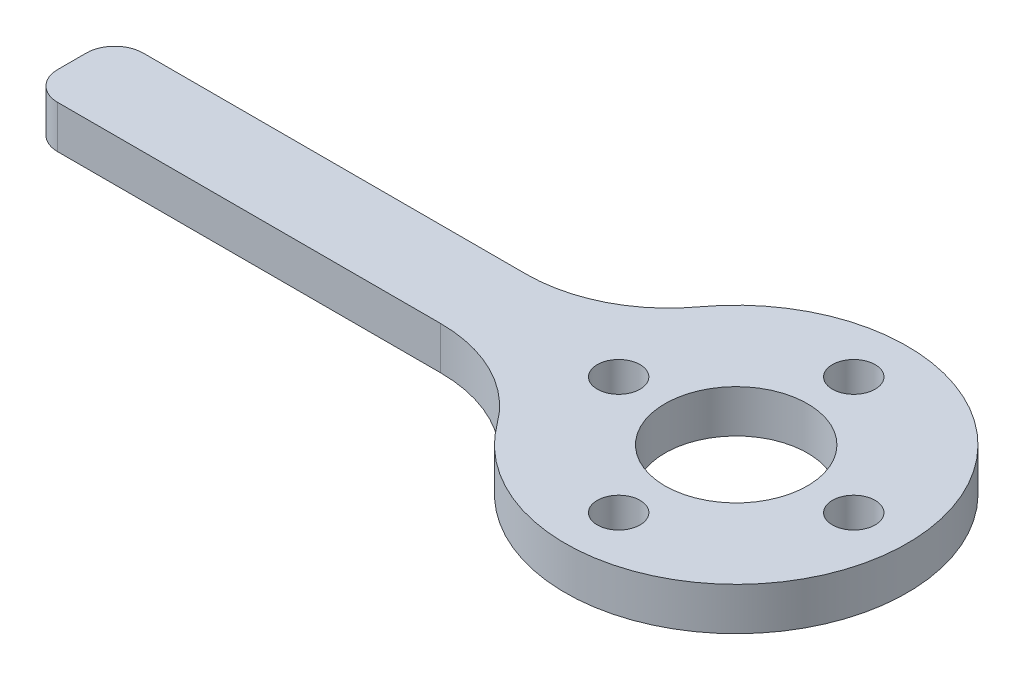
ISO-10303-21;
HEADER;
FILE_DESCRIPTION(('STEP AP214'),'2;1');
FILE_NAME('part.step','',(''),(''),'','','');
FILE_SCHEMA(('AUTOMOTIVE_DESIGN { 1 0 10303 214 1 1 1 1 }'));
ENDSEC;
DATA;
#1=APPLICATION_CONTEXT('core data for automotive mechanical design processes');
#2=APPLICATION_PROTOCOL_DEFINITION('international standard','automotive_design',2000,#1);
#3=PRODUCT_CONTEXT('',#1,'mechanical');
#4=PRODUCT('Part','Part','',(#3));
#5=PRODUCT_RELATED_PRODUCT_CATEGORY('part','',(#4));
#6=PRODUCT_DEFINITION_FORMATION('','',#4);
#7=PRODUCT_DEFINITION_CONTEXT('part definition',#1,'design');
#8=PRODUCT_DEFINITION('design','',#6,#7);
#9=PRODUCT_DEFINITION_SHAPE('','',#8);
#10=(LENGTH_UNIT() NAMED_UNIT(*) SI_UNIT(.MILLI.,.METRE.));
#11=(NAMED_UNIT(*) PLANE_ANGLE_UNIT() SI_UNIT($,.RADIAN.));
#12=(NAMED_UNIT(*) SI_UNIT($,.STERADIAN.) SOLID_ANGLE_UNIT());
#13=UNCERTAINTY_MEASURE_WITH_UNIT(LENGTH_MEASURE(1.E-05),#10,'distance_accuracy_value','');
#14=(GEOMETRIC_REPRESENTATION_CONTEXT(3) GLOBAL_UNCERTAINTY_ASSIGNED_CONTEXT((#13)) GLOBAL_UNIT_ASSIGNED_CONTEXT((#10,
#11,#12)) REPRESENTATION_CONTEXT('',''));
#15=CARTESIAN_POINT('',(0.,0.,0.));
#16=DIRECTION('',(0.,0.,1.));
#17=DIRECTION('',(1.,0.,0.));
#18=AXIS2_PLACEMENT_3D('',#15,#16,#17);
#19=CARTESIAN_POINT('',(0.,3.,0.));
#20=DIRECTION('',(0.,1.,0.));
#21=DIRECTION('',(0.,0.,1.));
#22=AXIS2_PLACEMENT_3D('',#19,#20,#21);
#23=PLANE('',#22);
#24=CARTESIAN_POINT('',(0.,3.,-8.25));
#25=DIRECTION('',(0.,1.,0.));
#26=DIRECTION('',(0.,0.,1.));
#27=AXIS2_PLACEMENT_3D('',#24,#25,#26);
#28=CIRCLE('',#27,1.5);
#29=CARTESIAN_POINT('',(0.,3.,-6.75));
#30=VERTEX_POINT('',#29);
#31=EDGE_CURVE('E322',#30,#30,#28,.T.);
#32=ORIENTED_EDGE('',*,*,#31,.F.);
#33=EDGE_LOOP('',(#32));
#34=FACE_BOUND('',#33,.T.);
#35=CARTESIAN_POINT('',(8.2500000000002,3.,-1.9867642048302E-13));
#36=DIRECTION('',(0.,1.,0.));
#37=DIRECTION('',(0.,0.,1.));
#38=AXIS2_PLACEMENT_3D('',#35,#36,#37);
#39=CIRCLE('',#38,1.5);
#40=CARTESIAN_POINT('',(8.2500000000002,3.,1.4999999999998));
#41=VERTEX_POINT('',#40);
#42=EDGE_CURVE('E328',#41,#41,#39,.T.);
#43=ORIENTED_EDGE('',*,*,#42,.F.);
#44=EDGE_LOOP('',(#43));
#45=FACE_BOUND('',#44,.T.);
#46=CARTESIAN_POINT('',(3.96847674161392E-13,3.,8.25));
#47=DIRECTION('',(0.,1.,0.));
#48=DIRECTION('',(0.,0.,1.));
#49=AXIS2_PLACEMENT_3D('',#46,#47,#48);
#50=CIRCLE('',#49,1.5);
#51=CARTESIAN_POINT('',(3.96847674161392E-13,3.,9.75));
#52=VERTEX_POINT('',#51);
#53=EDGE_CURVE('E336',#52,#52,#50,.T.);
#54=ORIENTED_EDGE('',*,*,#53,.F.);
#55=EDGE_LOOP('',(#54));
#56=FACE_BOUND('',#55,.T.);
#57=CARTESIAN_POINT('',(-8.2499999999998,3.,1.99686754092316E-13));
#58=DIRECTION('',(0.,1.,0.));
#59=DIRECTION('',(0.,0.,1.));
#60=AXIS2_PLACEMENT_3D('',#57,#58,#59);
#61=CIRCLE('',#60,1.5);
#62=CARTESIAN_POINT('',(-8.2499999999998,3.,1.5000000000002));
#63=VERTEX_POINT('',#62);
#64=EDGE_CURVE('E342',#63,#63,#61,.T.);
#65=ORIENTED_EDGE('',*,*,#64,.F.);
#66=EDGE_LOOP('',(#65));
#67=FACE_BOUND('',#66,.T.);
#68=CARTESIAN_POINT('',(0.,3.,0.));
#69=DIRECTION('',(0.,1.,0.));
#70=DIRECTION('',(0.,0.,1.));
#71=AXIS2_PLACEMENT_3D('',#68,#69,#70);
#72=CIRCLE('',#71,12.);
#73=CARTESIAN_POINT('',(-9.68085782689028,3.,7.09090909090909));
#74=VERTEX_POINT('',#73);
#75=CARTESIAN_POINT('',(-9.68085782689028,3.,-7.09090909090909));
#76=VERTEX_POINT('',#75);
#77=EDGE_CURVE('E128',#74,#76,#72,.T.);
#78=ORIENTED_EDGE('',*,*,#77,.T.);
#79=CARTESIAN_POINT('',(-17.7482393492988,3.,-13.));
#80=DIRECTION('',(0.,1.,0.));
#81=DIRECTION('',(0.,0.,1.));
#82=AXIS2_PLACEMENT_3D('',#79,#80,#81);
#83=CIRCLE('',#82,10.);
#84=CARTESIAN_POINT('',(-17.7482393492988,3.,-3.));
#85=VERTEX_POINT('',#84);
#86=EDGE_CURVE('E11',#76,#85,#83,.F.);
#87=ORIENTED_EDGE('',*,*,#86,.T.);
#88=DIRECTION('',(-1.,0.,0.));
#89=VECTOR('',#88,1.);
#90=CARTESIAN_POINT('',(-46.6189500386223,3.,-3.));
#91=LINE('',#90,#89);
#92=CARTESIAN_POINT('',(-44.6189500386223,3.,-3.));
#93=VERTEX_POINT('',#92);
#94=EDGE_CURVE('E166',#85,#93,#91,.T.);
#95=ORIENTED_EDGE('',*,*,#94,.T.);
#96=CARTESIAN_POINT('',(-44.6189500386223,3.,-1.));
#97=DIRECTION('',(0.,1.,0.));
#98=DIRECTION('',(0.,0.,1.));
#99=AXIS2_PLACEMENT_3D('',#96,#97,#98);
#100=CIRCLE('',#99,2.);
#101=CARTESIAN_POINT('',(-46.6189500386223,3.,-1.));
#102=VERTEX_POINT('',#101);
#103=EDGE_CURVE('E140',#93,#102,#100,.T.);
#104=ORIENTED_EDGE('',*,*,#103,.T.);
#105=DIRECTION('',(0.,0.,1.));
#106=VECTOR('',#105,1.);
#107=CARTESIAN_POINT('',(-46.6189500386223,3.,3.));
#108=LINE('',#107,#106);
#109=CARTESIAN_POINT('',(-46.6189500386223,3.,1.));
#110=VERTEX_POINT('',#109);
#111=EDGE_CURVE('E118',#102,#110,#108,.T.);
#112=ORIENTED_EDGE('',*,*,#111,.T.);
#113=CARTESIAN_POINT('',(-44.6189500386223,3.,1.));
#114=DIRECTION('',(0.,1.,0.));
#115=DIRECTION('',(0.,0.,1.));
#116=AXIS2_PLACEMENT_3D('',#113,#114,#115);
#117=CIRCLE('',#116,2.);
#118=CARTESIAN_POINT('',(-44.6189500386223,3.,3.));
#119=VERTEX_POINT('',#118);
#120=EDGE_CURVE('E138',#110,#119,#117,.T.);
#121=ORIENTED_EDGE('',*,*,#120,.T.);
#122=DIRECTION('',(1.,0.,0.));
#123=VECTOR('',#122,1.);
#124=CARTESIAN_POINT('',(-11.6189500386223,3.,3.));
#125=LINE('',#124,#123);
#126=CARTESIAN_POINT('',(-17.7482393492988,3.,3.));
#127=VERTEX_POINT('',#126);
#128=EDGE_CURVE('E134',#119,#127,#125,.T.);
#129=ORIENTED_EDGE('',*,*,#128,.T.);
#130=CARTESIAN_POINT('',(-17.7482393492988,3.,13.));
#131=DIRECTION('',(0.,1.,0.));
#132=DIRECTION('',(0.,0.,1.));
#133=AXIS2_PLACEMENT_3D('',#130,#131,#132);
#134=CIRCLE('',#133,10.);
#135=EDGE_CURVE('E156',#127,#74,#134,.F.);
#136=ORIENTED_EDGE('',*,*,#135,.T.);
#137=EDGE_LOOP('',(#78,#87,#95,#104,#112,#121,#129,#136));
#138=FACE_BOUND('',#137,.T.);
#139=CARTESIAN_POINT('',(0.,3.,0.));
#140=DIRECTION('',(0.,1.,0.));
#141=DIRECTION('',(0.,0.,1.));
#142=AXIS2_PLACEMENT_3D('',#139,#140,#141);
#143=CIRCLE('',#142,5.);
#144=CARTESIAN_POINT('',(0.,3.,5.));
#145=VERTEX_POINT('',#144);
#146=EDGE_CURVE('E163',#145,#145,#143,.T.);
#147=ORIENTED_EDGE('',*,*,#146,.F.);
#148=EDGE_LOOP('',(#147));
#149=FACE_BOUND('',#148,.T.);
#150=ADVANCED_FACE('F34',(#34,#45,#56,#67,#138,#149),#23,.T.);
#151=CARTESIAN_POINT('',(0.,0.,0.));
#152=DIRECTION('',(0.,1.,0.));
#153=DIRECTION('',(0.,0.,1.));
#154=AXIS2_PLACEMENT_3D('',#151,#152,#153);
#155=PLANE('',#154);
#156=CARTESIAN_POINT('',(0.,0.,-8.25));
#157=DIRECTION('',(0.,1.,0.));
#158=DIRECTION('',(0.,0.,1.));
#159=AXIS2_PLACEMENT_3D('',#156,#157,#158);
#160=CIRCLE('',#159,1.5);
#161=CARTESIAN_POINT('',(0.,0.,-6.75));
#162=VERTEX_POINT('',#161);
#163=EDGE_CURVE('E320',#162,#162,#160,.T.);
#164=ORIENTED_EDGE('',*,*,#163,.T.);
#165=EDGE_LOOP('',(#164));
#166=FACE_BOUND('',#165,.T.);
#167=CARTESIAN_POINT('',(8.2500000000002,0.,-1.9867642048302E-13));
#168=DIRECTION('',(0.,1.,0.));
#169=DIRECTION('',(0.,0.,1.));
#170=AXIS2_PLACEMENT_3D('',#167,#168,#169);
#171=CIRCLE('',#170,1.5);
#172=CARTESIAN_POINT('',(8.2500000000002,0.,1.4999999999998));
#173=VERTEX_POINT('',#172);
#174=EDGE_CURVE('E323',#173,#173,#171,.T.);
#175=ORIENTED_EDGE('',*,*,#174,.T.);
#176=EDGE_LOOP('',(#175));
#177=FACE_BOUND('',#176,.T.);
#178=CARTESIAN_POINT('',(3.96847674161392E-13,0.,8.25));
#179=DIRECTION('',(0.,1.,0.));
#180=DIRECTION('',(0.,0.,1.));
#181=AXIS2_PLACEMENT_3D('',#178,#179,#180);
#182=CIRCLE('',#181,1.5);
#183=CARTESIAN_POINT('',(3.96847674161392E-13,0.,9.75));
#184=VERTEX_POINT('',#183);
#185=EDGE_CURVE('E333',#184,#184,#182,.T.);
#186=ORIENTED_EDGE('',*,*,#185,.T.);
#187=EDGE_LOOP('',(#186));
#188=FACE_BOUND('',#187,.T.);
#189=CARTESIAN_POINT('',(-8.2499999999998,0.,1.99686754092316E-13));
#190=DIRECTION('',(0.,1.,0.));
#191=DIRECTION('',(0.,0.,1.));
#192=AXIS2_PLACEMENT_3D('',#189,#190,#191);
#193=CIRCLE('',#192,1.5);
#194=CARTESIAN_POINT('',(-8.2499999999998,0.,1.5000000000002));
#195=VERTEX_POINT('',#194);
#196=EDGE_CURVE('E339',#195,#195,#193,.T.);
#197=ORIENTED_EDGE('',*,*,#196,.T.);
#198=EDGE_LOOP('',(#197));
#199=FACE_BOUND('',#198,.T.);
#200=DIRECTION('',(0.,0.,1.));
#201=VECTOR('',#200,1.);
#202=CARTESIAN_POINT('',(-46.6189500386223,0.,3.));
#203=LINE('',#202,#201);
#204=CARTESIAN_POINT('',(-46.6189500386223,0.,-1.));
#205=VERTEX_POINT('',#204);
#206=CARTESIAN_POINT('',(-46.6189500386223,0.,1.));
#207=VERTEX_POINT('',#206);
#208=EDGE_CURVE('E115',#205,#207,#203,.T.);
#209=ORIENTED_EDGE('',*,*,#208,.F.);
#210=CARTESIAN_POINT('',(-44.6189500386223,0.,-1.));
#211=DIRECTION('',(0.,1.,0.));
#212=DIRECTION('',(0.,0.,1.));
#213=AXIS2_PLACEMENT_3D('',#210,#211,#212);
#214=CIRCLE('',#213,2.);
#215=CARTESIAN_POINT('',(-44.6189500386223,0.,-3.));
#216=VERTEX_POINT('',#215);
#217=EDGE_CURVE('E99',#205,#216,#214,.F.);
#218=ORIENTED_EDGE('',*,*,#217,.T.);
#219=DIRECTION('',(-1.,0.,0.));
#220=VECTOR('',#219,1.);
#221=CARTESIAN_POINT('',(-46.6189500386223,0.,-3.));
#222=LINE('',#221,#220);
#223=CARTESIAN_POINT('',(-17.7482393492988,0.,-3.));
#224=VERTEX_POINT('',#223);
#225=EDGE_CURVE('E125',#224,#216,#222,.T.);
#226=ORIENTED_EDGE('',*,*,#225,.F.);
#227=CARTESIAN_POINT('',(-17.7482393492988,0.,-13.));
#228=DIRECTION('',(0.,1.,0.));
#229=DIRECTION('',(0.,0.,1.));
#230=AXIS2_PLACEMENT_3D('',#227,#228,#229);
#231=CIRCLE('',#230,10.);
#232=CARTESIAN_POINT('',(-9.68085782689028,0.,-7.09090909090909));
#233=VERTEX_POINT('',#232);
#234=EDGE_CURVE('E42',#224,#233,#231,.T.);
#235=ORIENTED_EDGE('',*,*,#234,.T.);
#236=CARTESIAN_POINT('',(0.,0.,0.));
#237=DIRECTION('',(0.,1.,0.));
#238=DIRECTION('',(0.,0.,1.));
#239=AXIS2_PLACEMENT_3D('',#236,#237,#238);
#240=CIRCLE('',#239,12.);
#241=CARTESIAN_POINT('',(-9.68085782689028,0.,7.09090909090909));
#242=VERTEX_POINT('',#241);
#243=EDGE_CURVE('E130',#242,#233,#240,.T.);
#244=ORIENTED_EDGE('',*,*,#243,.F.);
#245=CARTESIAN_POINT('',(-17.7482393492988,0.,13.));
#246=DIRECTION('',(0.,1.,0.));
#247=DIRECTION('',(0.,0.,1.));
#248=AXIS2_PLACEMENT_3D('',#245,#246,#247);
#249=CIRCLE('',#248,10.);
#250=CARTESIAN_POINT('',(-17.7482393492988,0.,3.));
#251=VERTEX_POINT('',#250);
#252=EDGE_CURVE('E154',#242,#251,#249,.T.);
#253=ORIENTED_EDGE('',*,*,#252,.T.);
#254=DIRECTION('',(1.,0.,0.));
#255=VECTOR('',#254,1.);
#256=CARTESIAN_POINT('',(-11.6189500386223,0.,3.));
#257=LINE('',#256,#255);
#258=CARTESIAN_POINT('',(-44.6189500386223,0.,3.));
#259=VERTEX_POINT('',#258);
#260=EDGE_CURVE('E124',#259,#251,#257,.T.);
#261=ORIENTED_EDGE('',*,*,#260,.F.);
#262=CARTESIAN_POINT('',(-44.6189500386223,0.,1.));
#263=DIRECTION('',(0.,1.,0.));
#264=DIRECTION('',(0.,0.,1.));
#265=AXIS2_PLACEMENT_3D('',#262,#263,#264);
#266=CIRCLE('',#265,2.);
#267=EDGE_CURVE('E109',#259,#207,#266,.F.);
#268=ORIENTED_EDGE('',*,*,#267,.T.);
#269=EDGE_LOOP('',(#209,#218,#226,#235,#244,#253,#261,#268));
#270=FACE_BOUND('',#269,.T.);
#271=CARTESIAN_POINT('',(0.,0.,0.));
#272=DIRECTION('',(0.,1.,0.));
#273=DIRECTION('',(0.,0.,1.));
#274=AXIS2_PLACEMENT_3D('',#271,#272,#273);
#275=CIRCLE('',#274,5.);
#276=CARTESIAN_POINT('',(0.,0.,5.));
#277=VERTEX_POINT('',#276);
#278=EDGE_CURVE('E325',#277,#277,#275,.T.);
#279=ORIENTED_EDGE('',*,*,#278,.T.);
#280=EDGE_LOOP('',(#279));
#281=FACE_BOUND('',#280,.T.);
#282=ADVANCED_FACE('F121',(#166,#177,#188,#199,#270,#281),#155,.F.);
#283=CARTESIAN_POINT('',(0.,3.,0.));
#284=DIRECTION('',(0.,-1.,0.));
#285=DIRECTION('',(0.,0.,-1.));
#286=AXIS2_PLACEMENT_3D('',#283,#284,#285);
#287=CYLINDRICAL_SURFACE('',#286,12.);
#288=ORIENTED_EDGE('',*,*,#77,.F.);
#289=DIRECTION('',(0.,-1.,0.));
#290=VECTOR('',#289,1.);
#291=CARTESIAN_POINT('',(-9.68085782689028,3.,7.09090909090909));
#292=LINE('',#291,#290);
#293=EDGE_CURVE('E147',#74,#242,#292,.T.);
#294=ORIENTED_EDGE('',*,*,#293,.T.);
#295=ORIENTED_EDGE('',*,*,#243,.T.);
#296=DIRECTION('',(0.,-1.,0.));
#297=VECTOR('',#296,1.);
#298=CARTESIAN_POINT('',(-9.68085782689028,3.,-7.09090909090909));
#299=LINE('',#298,#297);
#300=EDGE_CURVE('E145',#233,#76,#299,.F.);
#301=ORIENTED_EDGE('',*,*,#300,.T.);
#302=EDGE_LOOP('',(#288,#294,#295,#301));
#303=FACE_BOUND('',#302,.T.);
#304=ADVANCED_FACE('F161',(#303),#287,.T.);
#305=CARTESIAN_POINT('',(-46.6189500386223,3.,-3.));
#306=DIRECTION('',(0.,0.,1.));
#307=DIRECTION('',(1.,0.,0.));
#308=AXIS2_PLACEMENT_3D('',#305,#306,#307);
#309=PLANE('',#308);
#310=ORIENTED_EDGE('',*,*,#94,.F.);
#311=DIRECTION('',(0.,1.,0.));
#312=VECTOR('',#311,1.);
#313=CARTESIAN_POINT('',(-17.7482393492988,0.,-3.));
#314=LINE('',#313,#312);
#315=EDGE_CURVE('E152',#85,#224,#314,.F.);
#316=ORIENTED_EDGE('',*,*,#315,.T.);
#317=ORIENTED_EDGE('',*,*,#225,.T.);
#318=DIRECTION('',(0.,-1.,0.));
#319=VECTOR('',#318,1.);
#320=CARTESIAN_POINT('',(-44.6189500386223,3.,-3.));
#321=LINE('',#320,#319);
#322=EDGE_CURVE('E105',#216,#93,#321,.F.);
#323=ORIENTED_EDGE('',*,*,#322,.T.);
#324=EDGE_LOOP('',(#310,#316,#317,#323));
#325=FACE_BOUND('',#324,.T.);
#326=ADVANCED_FACE('F165',(#325),#309,.F.);
#327=CARTESIAN_POINT('',(-46.6189500386223,3.,3.));
#328=DIRECTION('',(1.,0.,0.));
#329=DIRECTION('',(0.,0.,-1.));
#330=AXIS2_PLACEMENT_3D('',#327,#328,#329);
#331=PLANE('',#330);
#332=ORIENTED_EDGE('',*,*,#111,.F.);
#333=DIRECTION('',(0.,-1.,0.));
#334=VECTOR('',#333,1.);
#335=CARTESIAN_POINT('',(-46.6189500386223,3.,-1.));
#336=LINE('',#335,#334);
#337=EDGE_CURVE('E103',#102,#205,#336,.T.);
#338=ORIENTED_EDGE('',*,*,#337,.T.);
#339=ORIENTED_EDGE('',*,*,#208,.T.);
#340=DIRECTION('',(0.,-1.,0.));
#341=VECTOR('',#340,1.);
#342=CARTESIAN_POINT('',(-46.6189500386223,3.,1.));
#343=LINE('',#342,#341);
#344=EDGE_CURVE('E119',#207,#110,#343,.F.);
#345=ORIENTED_EDGE('',*,*,#344,.T.);
#346=EDGE_LOOP('',(#332,#338,#339,#345));
#347=FACE_BOUND('',#346,.T.);
#348=ADVANCED_FACE('F114',(#347),#331,.F.);
#349=CARTESIAN_POINT('',(-11.6189500386223,3.,3.));
#350=DIRECTION('',(0.,0.,-1.));
#351=DIRECTION('',(-1.,0.,0.));
#352=AXIS2_PLACEMENT_3D('',#349,#350,#351);
#353=PLANE('',#352);
#354=ORIENTED_EDGE('',*,*,#260,.T.);
#355=DIRECTION('',(0.,1.,0.));
#356=VECTOR('',#355,1.);
#357=CARTESIAN_POINT('',(-17.7482393492988,3.,3.));
#358=LINE('',#357,#356);
#359=EDGE_CURVE('E150',#251,#127,#358,.T.);
#360=ORIENTED_EDGE('',*,*,#359,.T.);
#361=ORIENTED_EDGE('',*,*,#128,.F.);
#362=DIRECTION('',(0.,-1.,0.));
#363=VECTOR('',#362,1.);
#364=CARTESIAN_POINT('',(-44.6189500386223,3.,3.));
#365=LINE('',#364,#363);
#366=EDGE_CURVE('E142',#119,#259,#365,.T.);
#367=ORIENTED_EDGE('',*,*,#366,.T.);
#368=EDGE_LOOP('',(#354,#360,#361,#367));
#369=FACE_BOUND('',#368,.T.);
#370=ADVANCED_FACE('F182',(#369),#353,.F.);
#371=CARTESIAN_POINT('',(0.,3.,0.));
#372=DIRECTION('',(0.,-1.,0.));
#373=DIRECTION('',(0.,0.,-1.));
#374=AXIS2_PLACEMENT_3D('',#371,#372,#373);
#375=CYLINDRICAL_SURFACE('',#374,5.);
#376=ORIENTED_EDGE('',*,*,#146,.T.);
#377=EDGE_LOOP('',(#376));
#378=FACE_BOUND('',#377,.T.);
#379=ORIENTED_EDGE('',*,*,#278,.F.);
#380=EDGE_LOOP('',(#379));
#381=FACE_BOUND('',#380,.T.);
#382=ADVANCED_FACE('F204',(#378,#381),#375,.F.);
#383=CARTESIAN_POINT('',(-8.2499999999998,0.,1.99686754092316E-13));
#384=DIRECTION('',(0.,1.,0.));
#385=DIRECTION('',(0.,0.,1.));
#386=AXIS2_PLACEMENT_3D('',#383,#384,#385);
#387=CYLINDRICAL_SURFACE('',#386,1.5);
#388=ORIENTED_EDGE('',*,*,#196,.F.);
#389=EDGE_LOOP('',(#388));
#390=FACE_BOUND('',#389,.T.);
#391=ORIENTED_EDGE('',*,*,#64,.T.);
#392=EDGE_LOOP('',(#391));
#393=FACE_BOUND('',#392,.T.);
#394=ADVANCED_FACE('F239',(#390,#393),#387,.F.);
#395=CARTESIAN_POINT('',(3.96847674161392E-13,0.,8.25));
#396=DIRECTION('',(0.,1.,0.));
#397=DIRECTION('',(0.,0.,1.));
#398=AXIS2_PLACEMENT_3D('',#395,#396,#397);
#399=CYLINDRICAL_SURFACE('',#398,1.5);
#400=ORIENTED_EDGE('',*,*,#185,.F.);
#401=EDGE_LOOP('',(#400));
#402=FACE_BOUND('',#401,.T.);
#403=ORIENTED_EDGE('',*,*,#53,.T.);
#404=EDGE_LOOP('',(#403));
#405=FACE_BOUND('',#404,.T.);
#406=ADVANCED_FACE('F246',(#402,#405),#399,.F.);
#407=CARTESIAN_POINT('',(8.2500000000002,0.,-1.9867642048302E-13));
#408=DIRECTION('',(0.,1.,0.));
#409=DIRECTION('',(0.,0.,1.));
#410=AXIS2_PLACEMENT_3D('',#407,#408,#409);
#411=CYLINDRICAL_SURFACE('',#410,1.5);
#412=ORIENTED_EDGE('',*,*,#174,.F.);
#413=EDGE_LOOP('',(#412));
#414=FACE_BOUND('',#413,.T.);
#415=ORIENTED_EDGE('',*,*,#42,.T.);
#416=EDGE_LOOP('',(#415));
#417=FACE_BOUND('',#416,.T.);
#418=ADVANCED_FACE('F253',(#414,#417),#411,.F.);
#419=CARTESIAN_POINT('',(0.,0.,-8.25));
#420=DIRECTION('',(0.,1.,0.));
#421=DIRECTION('',(0.,0.,1.));
#422=AXIS2_PLACEMENT_3D('',#419,#420,#421);
#423=CYLINDRICAL_SURFACE('',#422,1.5);
#424=ORIENTED_EDGE('',*,*,#163,.F.);
#425=EDGE_LOOP('',(#424));
#426=FACE_BOUND('',#425,.T.);
#427=ORIENTED_EDGE('',*,*,#31,.T.);
#428=EDGE_LOOP('',(#427));
#429=FACE_BOUND('',#428,.T.);
#430=ADVANCED_FACE('F191',(#426,#429),#423,.F.);
#431=CARTESIAN_POINT('',(-44.6189500386223,3.,-1.));
#432=DIRECTION('',(0.,-1.,0.));
#433=DIRECTION('',(0.,0.,-1.));
#434=AXIS2_PLACEMENT_3D('',#431,#432,#433);
#435=CYLINDRICAL_SURFACE('',#434,2.);
#436=ORIENTED_EDGE('',*,*,#103,.F.);
#437=ORIENTED_EDGE('',*,*,#322,.F.);
#438=ORIENTED_EDGE('',*,*,#217,.F.);
#439=ORIENTED_EDGE('',*,*,#337,.F.);
#440=EDGE_LOOP('',(#436,#437,#438,#439));
#441=FACE_BOUND('',#440,.T.);
#442=ADVANCED_FACE('F102',(#441),#435,.T.);
#443=CARTESIAN_POINT('',(-44.6189500386223,3.,1.));
#444=DIRECTION('',(0.,-1.,0.));
#445=DIRECTION('',(0.,0.,-1.));
#446=AXIS2_PLACEMENT_3D('',#443,#444,#445);
#447=CYLINDRICAL_SURFACE('',#446,2.);
#448=ORIENTED_EDGE('',*,*,#120,.F.);
#449=ORIENTED_EDGE('',*,*,#344,.F.);
#450=ORIENTED_EDGE('',*,*,#267,.F.);
#451=ORIENTED_EDGE('',*,*,#366,.F.);
#452=EDGE_LOOP('',(#448,#449,#450,#451));
#453=FACE_BOUND('',#452,.T.);
#454=ADVANCED_FACE('F184',(#453),#447,.T.);
#455=CARTESIAN_POINT('',(-17.7482393492988,3.,13.));
#456=DIRECTION('',(0.,-1.,0.));
#457=DIRECTION('',(0.,0.,-1.));
#458=AXIS2_PLACEMENT_3D('',#455,#456,#457);
#459=CYLINDRICAL_SURFACE('',#458,10.);
#460=ORIENTED_EDGE('',*,*,#135,.F.);
#461=ORIENTED_EDGE('',*,*,#359,.F.);
#462=ORIENTED_EDGE('',*,*,#252,.F.);
#463=ORIENTED_EDGE('',*,*,#293,.F.);
#464=EDGE_LOOP('',(#460,#461,#462,#463));
#465=FACE_BOUND('',#464,.T.);
#466=ADVANCED_FACE('F181',(#465),#459,.F.);
#467=CARTESIAN_POINT('',(-17.7482393492988,3.,-13.));
#468=DIRECTION('',(0.,-1.,0.));
#469=DIRECTION('',(0.,0.,-1.));
#470=AXIS2_PLACEMENT_3D('',#467,#468,#469);
#471=CYLINDRICAL_SURFACE('',#470,10.);
#472=ORIENTED_EDGE('',*,*,#86,.F.);
#473=ORIENTED_EDGE('',*,*,#300,.F.);
#474=ORIENTED_EDGE('',*,*,#234,.F.);
#475=ORIENTED_EDGE('',*,*,#315,.F.);
#476=EDGE_LOOP('',(#472,#473,#474,#475));
#477=FACE_BOUND('',#476,.T.);
#478=ADVANCED_FACE('F36',(#477),#471,.F.);
#479=CLOSED_SHELL('',(#150,#282,#304,#326,#348,#370,#382,#394,#406,#418,#430,#442,#454,#466,#478));
#480=MANIFOLD_SOLID_BREP('B2',#479);
#481=ADVANCED_BREP_SHAPE_REPRESENTATION('',(#18,#480),#14);
#482=SHAPE_DEFINITION_REPRESENTATION(#9,#481);
ENDSEC;
END-ISO-10303-21;
